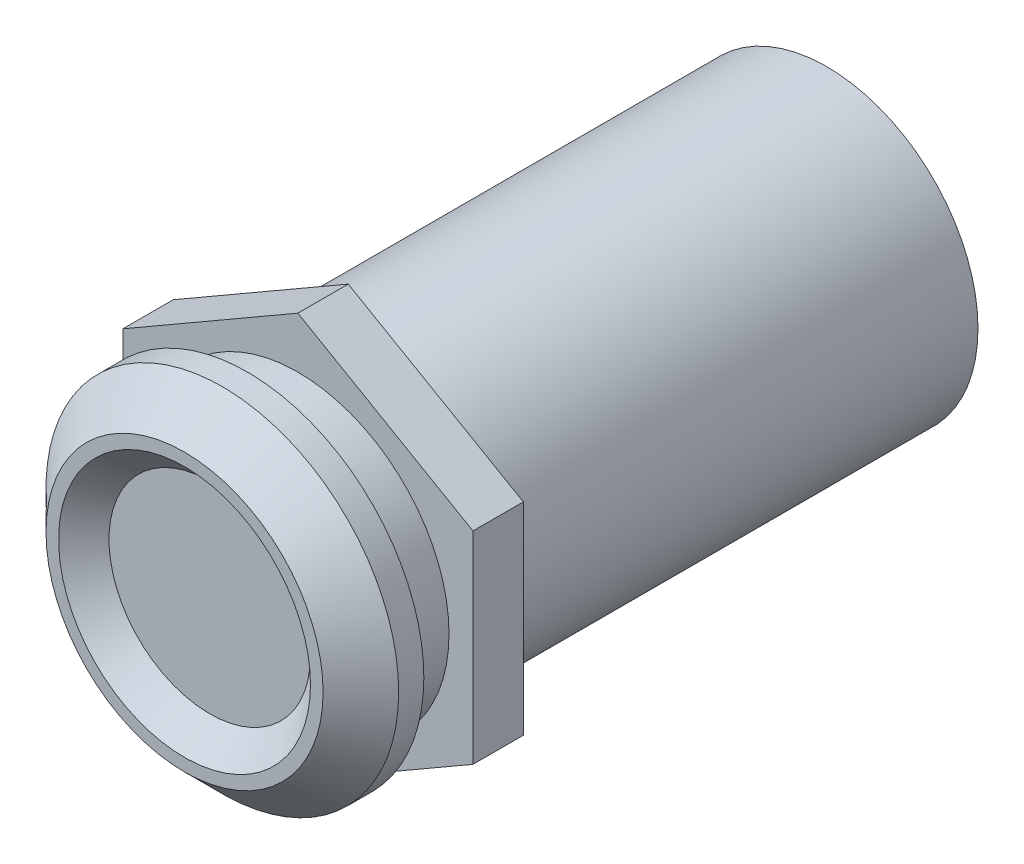
ISO-10303-21;
HEADER;
FILE_DESCRIPTION(('STEP AP214'),'2;1');
FILE_NAME('part.step','',(''),(''),'','','');
FILE_SCHEMA(('AUTOMOTIVE_DESIGN { 1 0 10303 214 1 1 1 1 }'));
ENDSEC;
DATA;
#1=APPLICATION_CONTEXT('core data for automotive mechanical design processes');
#2=APPLICATION_PROTOCOL_DEFINITION('international standard','automotive_design',2000,#1);
#3=PRODUCT_CONTEXT('',#1,'mechanical');
#4=PRODUCT('Part','Part','',(#3));
#5=PRODUCT_RELATED_PRODUCT_CATEGORY('part','',(#4));
#6=PRODUCT_DEFINITION_FORMATION('','',#4);
#7=PRODUCT_DEFINITION_CONTEXT('part definition',#1,'design');
#8=PRODUCT_DEFINITION('design','',#6,#7);
#9=PRODUCT_DEFINITION_SHAPE('','',#8);
#10=(LENGTH_UNIT() NAMED_UNIT(*) SI_UNIT(.MILLI.,.METRE.));
#11=(NAMED_UNIT(*) PLANE_ANGLE_UNIT() SI_UNIT($,.RADIAN.));
#12=(NAMED_UNIT(*) SI_UNIT($,.STERADIAN.) SOLID_ANGLE_UNIT());
#13=UNCERTAINTY_MEASURE_WITH_UNIT(LENGTH_MEASURE(1.E-05),#10,'distance_accuracy_value','');
#14=(GEOMETRIC_REPRESENTATION_CONTEXT(3) GLOBAL_UNCERTAINTY_ASSIGNED_CONTEXT((#13)) GLOBAL_UNIT_ASSIGNED_CONTEXT((#10,
#11,#12)) REPRESENTATION_CONTEXT('',''));
#15=CARTESIAN_POINT('',(0.,0.,0.));
#16=DIRECTION('',(0.,0.,1.));
#17=DIRECTION('',(1.,0.,0.));
#18=AXIS2_PLACEMENT_3D('',#15,#16,#17);
#19=CARTESIAN_POINT('',(0.,0.,1.));
#20=DIRECTION('',(0.,0.,-1.));
#21=DIRECTION('',(-1.,0.,0.));
#22=AXIS2_PLACEMENT_3D('',#19,#20,#21);
#23=CYLINDRICAL_SURFACE('',#22,7.);
#24=CARTESIAN_POINT('',(0.,0.,1.));
#25=DIRECTION('',(0.,0.,1.));
#26=DIRECTION('',(1.,0.,0.));
#27=AXIS2_PLACEMENT_3D('',#24,#25,#26);
#28=CIRCLE('',#27,7.);
#29=CARTESIAN_POINT('',(7.,0.,1.));
#30=VERTEX_POINT('',#29);
#31=EDGE_CURVE('E53',#30,#30,#28,.T.);
#32=ORIENTED_EDGE('',*,*,#31,.F.);
#33=EDGE_LOOP('',(#32));
#34=FACE_BOUND('',#33,.T.);
#35=CARTESIAN_POINT('',(0.,0.,0.));
#36=DIRECTION('',(0.,0.,1.));
#37=DIRECTION('',(1.,0.,0.));
#38=AXIS2_PLACEMENT_3D('',#35,#36,#37);
#39=CIRCLE('',#38,7.);
#40=CARTESIAN_POINT('',(7.,0.,0.));
#41=VERTEX_POINT('',#40);
#42=EDGE_CURVE('E168',#41,#41,#39,.T.);
#43=ORIENTED_EDGE('',*,*,#42,.T.);
#44=EDGE_LOOP('',(#43));
#45=FACE_BOUND('',#44,.T.);
#46=ADVANCED_FACE('F44',(#34,#45),#23,.T.);
#47=CARTESIAN_POINT('',(0.,0.,0.));
#48=DIRECTION('',(0.,0.,1.));
#49=DIRECTION('',(1.,0.,0.));
#50=AXIS2_PLACEMENT_3D('',#47,#48,#49);
#51=PLANE('',#50);
#52=CARTESIAN_POINT('',(0.,0.,0.));
#53=DIRECTION('',(0.,0.,1.));
#54=DIRECTION('',(1.,0.,0.));
#55=AXIS2_PLACEMENT_3D('',#52,#53,#54);
#56=CIRCLE('',#55,6.);
#57=CARTESIAN_POINT('',(6.,0.,0.));
#58=VERTEX_POINT('',#57);
#59=EDGE_CURVE('E157',#58,#58,#56,.T.);
#60=ORIENTED_EDGE('',*,*,#59,.T.);
#61=EDGE_LOOP('',(#60));
#62=FACE_BOUND('',#61,.T.);
#63=ORIENTED_EDGE('',*,*,#42,.F.);
#64=EDGE_LOOP('',(#63));
#65=FACE_BOUND('',#64,.T.);
#66=ADVANCED_FACE('F180',(#62,#65),#51,.F.);
#67=CARTESIAN_POINT('',(0.,0.,1.));
#68=DIRECTION('',(0.,0.,-1.));
#69=DIRECTION('',(1.,0.,0.));
#70=AXIS2_PLACEMENT_3D('',#67,#68,#69);
#71=CONICAL_SURFACE('',#70,7.,0.78539816339745);
#72=CARTESIAN_POINT('',(0.,0.,2.5));
#73=DIRECTION('',(0.,0.,1.));
#74=DIRECTION('',(1.,0.,0.));
#75=AXIS2_PLACEMENT_3D('',#72,#73,#74);
#76=CIRCLE('',#75,5.5);
#77=CARTESIAN_POINT('',(5.5,0.,2.5));
#78=VERTEX_POINT('',#77);
#79=EDGE_CURVE('E170',#78,#78,#76,.T.);
#80=ORIENTED_EDGE('',*,*,#79,.F.);
#81=EDGE_LOOP('',(#80));
#82=FACE_BOUND('',#81,.T.);
#83=ORIENTED_EDGE('',*,*,#31,.T.);
#84=EDGE_LOOP('',(#83));
#85=FACE_BOUND('',#84,.T.);
#86=ADVANCED_FACE('F176',(#82,#85),#71,.T.);
#87=CARTESIAN_POINT('',(0.,0.,2.5));
#88=DIRECTION('',(0.,0.,1.));
#89=DIRECTION('',(1.,0.,0.));
#90=AXIS2_PLACEMENT_3D('',#87,#88,#89);
#91=PLANE('',#90);
#92=CARTESIAN_POINT('',(0.,0.,2.5));
#93=DIRECTION('',(0.,0.,1.));
#94=DIRECTION('',(1.,0.,0.));
#95=AXIS2_PLACEMENT_3D('',#92,#93,#94);
#96=CIRCLE('',#95,5.);
#97=CARTESIAN_POINT('',(5.,0.,2.5));
#98=VERTEX_POINT('',#97);
#99=EDGE_CURVE('E158',#98,#98,#96,.T.);
#100=ORIENTED_EDGE('',*,*,#99,.F.);
#101=EDGE_LOOP('',(#100));
#102=FACE_BOUND('',#101,.T.);
#103=ORIENTED_EDGE('',*,*,#79,.T.);
#104=EDGE_LOOP('',(#103));
#105=FACE_BOUND('',#104,.T.);
#106=ADVANCED_FACE('F187',(#102,#105),#91,.T.);
#107=CARTESIAN_POINT('',(0.,0.,2.5));
#108=DIRECTION('',(0.,0.,1.));
#109=DIRECTION('',(1.,0.,0.));
#110=AXIS2_PLACEMENT_3D('',#107,#108,#109);
#111=CONICAL_SURFACE('',#110,5.,0.78539816339745);
#112=CARTESIAN_POINT('',(0.,0.,1.5));
#113=DIRECTION('',(0.,0.,1.));
#114=DIRECTION('',(1.,0.,0.));
#115=AXIS2_PLACEMENT_3D('',#112,#113,#114);
#116=CIRCLE('',#115,3.99999999999999);
#117=CARTESIAN_POINT('',(3.99999999999999,0.,1.5));
#118=VERTEX_POINT('',#117);
#119=EDGE_CURVE('E163',#118,#118,#116,.T.);
#120=ORIENTED_EDGE('',*,*,#119,.F.);
#121=EDGE_LOOP('',(#120));
#122=FACE_BOUND('',#121,.T.);
#123=ORIENTED_EDGE('',*,*,#99,.T.);
#124=EDGE_LOOP('',(#123));
#125=FACE_BOUND('',#124,.T.);
#126=ADVANCED_FACE('F192',(#122,#125),#111,.F.);
#127=CARTESIAN_POINT('',(0.,0.,1.5));
#128=DIRECTION('',(0.,0.,1.));
#129=DIRECTION('',(1.,0.,0.));
#130=AXIS2_PLACEMENT_3D('',#127,#128,#129);
#131=PLANE('',#130);
#132=ORIENTED_EDGE('',*,*,#119,.T.);
#133=EDGE_LOOP('',(#132));
#134=FACE_BOUND('',#133,.T.);
#135=ADVANCED_FACE('F196',(#134),#131,.T.);
#136=CARTESIAN_POINT('',(0.,0.,-23.));
#137=DIRECTION('',(0.,0.,1.));
#138=DIRECTION('',(1.,0.,0.));
#139=AXIS2_PLACEMENT_3D('',#136,#137,#138);
#140=CYLINDRICAL_SURFACE('',#139,6.);
#141=CARTESIAN_POINT('',(0.,0.,-2.));
#142=DIRECTION('',(0.,0.,1.));
#143=DIRECTION('',(1.,0.,0.));
#144=AXIS2_PLACEMENT_3D('',#141,#142,#143);
#145=CIRCLE('',#144,6.);
#146=CARTESIAN_POINT('',(6.,0.,-2.));
#147=VERTEX_POINT('',#146);
#148=EDGE_CURVE('E11',#147,#147,#145,.F.);
#149=ORIENTED_EDGE('',*,*,#148,.F.);
#150=EDGE_LOOP('',(#149));
#151=FACE_BOUND('',#150,.T.);
#152=ORIENTED_EDGE('',*,*,#59,.F.);
#153=EDGE_LOOP('',(#152));
#154=FACE_BOUND('',#153,.T.);
#155=ADVANCED_FACE('F205',(#151,#154),#140,.T.);
#156=CARTESIAN_POINT('',(6.95,4.0125843708679,-4.));
#157=DIRECTION('',(0.5,0.866025403784439,0.));
#158=DIRECTION('',(-0.866025403784439,0.5,0.));
#159=AXIS2_PLACEMENT_3D('',#156,#157,#158);
#160=PLANE('',#159);
#161=DIRECTION('',(-0.866025403784439,0.5,0.));
#162=VECTOR('',#161,1.);
#163=CARTESIAN_POINT('',(6.95,4.0125843708679,-2.));
#164=LINE('',#163,#162);
#165=CARTESIAN_POINT('',(6.95,4.0125843708679,-2.));
#166=VERTEX_POINT('',#165);
#167=CARTESIAN_POINT('',(0.,8.0251687417358,-2.));
#168=VERTEX_POINT('',#167);
#169=EDGE_CURVE('E133',#166,#168,#164,.T.);
#170=ORIENTED_EDGE('',*,*,#169,.F.);
#171=DIRECTION('',(0.,0.,1.));
#172=VECTOR('',#171,1.);
#173=CARTESIAN_POINT('',(6.95,4.0125843708679,-4.));
#174=LINE('',#173,#172);
#175=CARTESIAN_POINT('',(6.95,4.0125843708679,-4.));
#176=VERTEX_POINT('',#175);
#177=EDGE_CURVE('E65',#176,#166,#174,.T.);
#178=ORIENTED_EDGE('',*,*,#177,.F.);
#179=DIRECTION('',(-0.866025403784439,0.5,0.));
#180=VECTOR('',#179,1.);
#181=CARTESIAN_POINT('',(6.95,4.0125843708679,-4.));
#182=LINE('',#181,#180);
#183=CARTESIAN_POINT('',(0.,8.0251687417358,-4.));
#184=VERTEX_POINT('',#183);
#185=EDGE_CURVE('E146',#176,#184,#182,.T.);
#186=ORIENTED_EDGE('',*,*,#185,.T.);
#187=DIRECTION('',(0.,0.,1.));
#188=VECTOR('',#187,1.);
#189=CARTESIAN_POINT('',(0.,8.0251687417358,-4.));
#190=LINE('',#189,#188);
#191=EDGE_CURVE('E100',#184,#168,#190,.T.);
#192=ORIENTED_EDGE('',*,*,#191,.T.);
#193=EDGE_LOOP('',(#170,#178,#186,#192));
#194=FACE_BOUND('',#193,.T.);
#195=ADVANCED_FACE('F206',(#194),#160,.T.);
#196=CARTESIAN_POINT('',(6.95,-4.0125843708679,-4.));
#197=DIRECTION('',(1.,0.,0.));
#198=DIRECTION('',(0.,1.,0.));
#199=AXIS2_PLACEMENT_3D('',#196,#197,#198);
#200=PLANE('',#199);
#201=DIRECTION('',(0.,1.,0.));
#202=VECTOR('',#201,1.);
#203=CARTESIAN_POINT('',(6.95,-4.0125843708679,-2.));
#204=LINE('',#203,#202);
#205=CARTESIAN_POINT('',(6.95,-4.0125843708679,-2.));
#206=VERTEX_POINT('',#205);
#207=EDGE_CURVE('E144',#206,#166,#204,.T.);
#208=ORIENTED_EDGE('',*,*,#207,.F.);
#209=DIRECTION('',(0.,0.,1.));
#210=VECTOR('',#209,1.);
#211=CARTESIAN_POINT('',(6.95,-4.0125843708679,-4.));
#212=LINE('',#211,#210);
#213=CARTESIAN_POINT('',(6.95,-4.0125843708679,-4.));
#214=VERTEX_POINT('',#213);
#215=EDGE_CURVE('E84',#214,#206,#212,.T.);
#216=ORIENTED_EDGE('',*,*,#215,.F.);
#217=DIRECTION('',(0.,1.,0.));
#218=VECTOR('',#217,1.);
#219=CARTESIAN_POINT('',(6.95,-4.0125843708679,-4.));
#220=LINE('',#219,#218);
#221=EDGE_CURVE('E124',#214,#176,#220,.T.);
#222=ORIENTED_EDGE('',*,*,#221,.T.);
#223=ORIENTED_EDGE('',*,*,#177,.T.);
#224=EDGE_LOOP('',(#208,#216,#222,#223));
#225=FACE_BOUND('',#224,.T.);
#226=ADVANCED_FACE('F214',(#225),#200,.T.);
#227=CARTESIAN_POINT('',(0.,-8.0251687417358,-4.));
#228=DIRECTION('',(0.5,-0.866025403784439,0.));
#229=DIRECTION('',(0.866025403784439,0.5,0.));
#230=AXIS2_PLACEMENT_3D('',#227,#228,#229);
#231=PLANE('',#230);
#232=DIRECTION('',(0.866025403784439,0.5,0.));
#233=VECTOR('',#232,1.);
#234=CARTESIAN_POINT('',(0.,-8.0251687417358,-2.));
#235=LINE('',#234,#233);
#236=CARTESIAN_POINT('',(0.,-8.0251687417358,-2.));
#237=VERTEX_POINT('',#236);
#238=EDGE_CURVE('E109',#237,#206,#235,.T.);
#239=ORIENTED_EDGE('',*,*,#238,.F.);
#240=DIRECTION('',(0.,0.,1.));
#241=VECTOR('',#240,1.);
#242=CARTESIAN_POINT('',(0.,-8.0251687417358,-4.));
#243=LINE('',#242,#241);
#244=CARTESIAN_POINT('',(0.,-8.0251687417358,-4.));
#245=VERTEX_POINT('',#244);
#246=EDGE_CURVE('E104',#245,#237,#243,.T.);
#247=ORIENTED_EDGE('',*,*,#246,.F.);
#248=DIRECTION('',(0.866025403784439,0.5,0.));
#249=VECTOR('',#248,1.);
#250=CARTESIAN_POINT('',(0.,-8.0251687417358,-4.));
#251=LINE('',#250,#249);
#252=EDGE_CURVE('E107',#245,#214,#251,.T.);
#253=ORIENTED_EDGE('',*,*,#252,.T.);
#254=ORIENTED_EDGE('',*,*,#215,.T.);
#255=EDGE_LOOP('',(#239,#247,#253,#254));
#256=FACE_BOUND('',#255,.T.);
#257=ADVANCED_FACE('F110',(#256),#231,.T.);
#258=CARTESIAN_POINT('',(-6.95,-4.0125843708679,-4.));
#259=DIRECTION('',(-0.5,-0.866025403784439,0.));
#260=DIRECTION('',(0.866025403784439,-0.5,0.));
#261=AXIS2_PLACEMENT_3D('',#258,#259,#260);
#262=PLANE('',#261);
#263=DIRECTION('',(0.866025403784439,-0.5,0.));
#264=VECTOR('',#263,1.);
#265=CARTESIAN_POINT('',(-6.95,-4.0125843708679,-2.));
#266=LINE('',#265,#264);
#267=CARTESIAN_POINT('',(-6.95,-4.0125843708679,-2.));
#268=VERTEX_POINT('',#267);
#269=EDGE_CURVE('E142',#268,#237,#266,.T.);
#270=ORIENTED_EDGE('',*,*,#269,.F.);
#271=DIRECTION('',(0.,0.,1.));
#272=VECTOR('',#271,1.);
#273=CARTESIAN_POINT('',(-6.95,-4.0125843708679,-4.));
#274=LINE('',#273,#272);
#275=CARTESIAN_POINT('',(-6.95,-4.0125843708679,-4.));
#276=VERTEX_POINT('',#275);
#277=EDGE_CURVE('E113',#276,#268,#274,.T.);
#278=ORIENTED_EDGE('',*,*,#277,.F.);
#279=DIRECTION('',(0.866025403784439,-0.5,0.));
#280=VECTOR('',#279,1.);
#281=CARTESIAN_POINT('',(-6.95,-4.0125843708679,-4.));
#282=LINE('',#281,#280);
#283=EDGE_CURVE('E122',#276,#245,#282,.T.);
#284=ORIENTED_EDGE('',*,*,#283,.T.);
#285=ORIENTED_EDGE('',*,*,#246,.T.);
#286=EDGE_LOOP('',(#270,#278,#284,#285));
#287=FACE_BOUND('',#286,.T.);
#288=ADVANCED_FACE('F123',(#287),#262,.T.);
#289=CARTESIAN_POINT('',(-6.95,4.0125843708679,-4.));
#290=DIRECTION('',(-1.,0.,0.));
#291=DIRECTION('',(0.,-1.,0.));
#292=AXIS2_PLACEMENT_3D('',#289,#290,#291);
#293=PLANE('',#292);
#294=DIRECTION('',(0.,-1.,0.));
#295=VECTOR('',#294,1.);
#296=CARTESIAN_POINT('',(-6.95,4.0125843708679,-2.));
#297=LINE('',#296,#295);
#298=CARTESIAN_POINT('',(-6.95,4.0125843708679,-2.));
#299=VERTEX_POINT('',#298);
#300=EDGE_CURVE('E137',#299,#268,#297,.T.);
#301=ORIENTED_EDGE('',*,*,#300,.F.);
#302=DIRECTION('',(0.,0.,1.));
#303=VECTOR('',#302,1.);
#304=CARTESIAN_POINT('',(-6.95,4.0125843708679,-4.));
#305=LINE('',#304,#303);
#306=CARTESIAN_POINT('',(-6.95,4.0125843708679,-4.));
#307=VERTEX_POINT('',#306);
#308=EDGE_CURVE('E155',#307,#299,#305,.T.);
#309=ORIENTED_EDGE('',*,*,#308,.F.);
#310=DIRECTION('',(0.,-1.,0.));
#311=VECTOR('',#310,1.);
#312=CARTESIAN_POINT('',(-6.95,4.0125843708679,-4.));
#313=LINE('',#312,#311);
#314=EDGE_CURVE('E127',#307,#276,#313,.T.);
#315=ORIENTED_EDGE('',*,*,#314,.T.);
#316=ORIENTED_EDGE('',*,*,#277,.T.);
#317=EDGE_LOOP('',(#301,#309,#315,#316));
#318=FACE_BOUND('',#317,.T.);
#319=ADVANCED_FACE('F218',(#318),#293,.T.);
#320=CARTESIAN_POINT('',(0.,8.0251687417358,-4.));
#321=DIRECTION('',(-0.5,0.866025403784439,0.));
#322=DIRECTION('',(-0.866025403784439,-0.5,0.));
#323=AXIS2_PLACEMENT_3D('',#320,#321,#322);
#324=PLANE('',#323);
#325=DIRECTION('',(-0.866025403784439,-0.5,0.));
#326=VECTOR('',#325,1.);
#327=CARTESIAN_POINT('',(0.,8.0251687417358,-2.));
#328=LINE('',#327,#326);
#329=EDGE_CURVE('E136',#168,#299,#328,.T.);
#330=ORIENTED_EDGE('',*,*,#329,.F.);
#331=ORIENTED_EDGE('',*,*,#191,.F.);
#332=DIRECTION('',(-0.866025403784439,-0.5,0.));
#333=VECTOR('',#332,1.);
#334=CARTESIAN_POINT('',(0.,8.0251687417358,-4.));
#335=LINE('',#334,#333);
#336=EDGE_CURVE('E126',#184,#307,#335,.T.);
#337=ORIENTED_EDGE('',*,*,#336,.T.);
#338=ORIENTED_EDGE('',*,*,#308,.T.);
#339=EDGE_LOOP('',(#330,#331,#337,#338));
#340=FACE_BOUND('',#339,.T.);
#341=ADVANCED_FACE('F216',(#340),#324,.T.);
#342=CARTESIAN_POINT('',(0.,0.,-4.));
#343=DIRECTION('',(0.,0.,1.));
#344=DIRECTION('',(1.,0.,0.));
#345=AXIS2_PLACEMENT_3D('',#342,#343,#344);
#346=PLANE('',#345);
#347=CARTESIAN_POINT('',(0.,0.,-4.));
#348=DIRECTION('',(0.,0.,1.));
#349=DIRECTION('',(1.,0.,0.));
#350=AXIS2_PLACEMENT_3D('',#347,#348,#349);
#351=CIRCLE('',#350,6.);
#352=CARTESIAN_POINT('',(6.,0.,-4.));
#353=VERTEX_POINT('',#352);
#354=EDGE_CURVE('E48',#353,#353,#351,.F.);
#355=ORIENTED_EDGE('',*,*,#354,.F.);
#356=EDGE_LOOP('',(#355));
#357=FACE_BOUND('',#356,.T.);
#358=ORIENTED_EDGE('',*,*,#185,.F.);
#359=ORIENTED_EDGE('',*,*,#221,.F.);
#360=ORIENTED_EDGE('',*,*,#252,.F.);
#361=ORIENTED_EDGE('',*,*,#283,.F.);
#362=ORIENTED_EDGE('',*,*,#314,.F.);
#363=ORIENTED_EDGE('',*,*,#336,.F.);
#364=EDGE_LOOP('',(#358,#359,#360,#361,#362,#363));
#365=FACE_BOUND('',#364,.T.);
#366=ADVANCED_FACE('F119',(#357,#365),#346,.F.);
#367=CARTESIAN_POINT('',(0.,0.,-2.));
#368=DIRECTION('',(0.,0.,1.));
#369=DIRECTION('',(1.,0.,0.));
#370=AXIS2_PLACEMENT_3D('',#367,#368,#369);
#371=PLANE('',#370);
#372=ORIENTED_EDGE('',*,*,#148,.T.);
#373=EDGE_LOOP('',(#372));
#374=FACE_BOUND('',#373,.T.);
#375=ORIENTED_EDGE('',*,*,#169,.T.);
#376=ORIENTED_EDGE('',*,*,#329,.T.);
#377=ORIENTED_EDGE('',*,*,#300,.T.);
#378=ORIENTED_EDGE('',*,*,#269,.T.);
#379=ORIENTED_EDGE('',*,*,#238,.T.);
#380=ORIENTED_EDGE('',*,*,#207,.T.);
#381=EDGE_LOOP('',(#375,#376,#377,#378,#379,#380));
#382=FACE_BOUND('',#381,.T.);
#383=ADVANCED_FACE('F211',(#374,#382),#371,.T.);
#384=CARTESIAN_POINT('',(0.,0.,-23.));
#385=DIRECTION('',(0.,0.,1.));
#386=DIRECTION('',(1.,0.,0.));
#387=AXIS2_PLACEMENT_3D('',#384,#385,#386);
#388=PLANE('',#387);
#389=CARTESIAN_POINT('',(0.,0.,-23.));
#390=DIRECTION('',(0.,0.,1.));
#391=DIRECTION('',(1.,0.,0.));
#392=AXIS2_PLACEMENT_3D('',#389,#390,#391);
#393=CIRCLE('',#392,6.);
#394=CARTESIAN_POINT('',(6.,0.,-23.));
#395=VERTEX_POINT('',#394);
#396=EDGE_CURVE('E154',#395,#395,#393,.T.);
#397=ORIENTED_EDGE('',*,*,#396,.F.);
#398=EDGE_LOOP('',(#397));
#399=FACE_BOUND('',#398,.T.);
#400=ADVANCED_FACE('F207',(#399),#388,.F.);
#401=ORIENTED_EDGE('',*,*,#396,.T.);
#402=EDGE_LOOP('',(#401));
#403=FACE_BOUND('',#402,.T.);
#404=ORIENTED_EDGE('',*,*,#354,.T.);
#405=EDGE_LOOP('',(#404));
#406=FACE_BOUND('',#405,.T.);
#407=ADVANCED_FACE('F208',(#403,#406),#140,.T.);
#408=CLOSED_SHELL('',(#46,#66,#86,#106,#126,#135,#155,#195,#226,#257,#288,#319,#341,#366,#383,
#400,#407));
#409=MANIFOLD_SOLID_BREP('B2',#408);
#410=ADVANCED_BREP_SHAPE_REPRESENTATION('',(#18,#409),#14);
#411=SHAPE_DEFINITION_REPRESENTATION(#9,#410);
ENDSEC;
END-ISO-10303-21;
